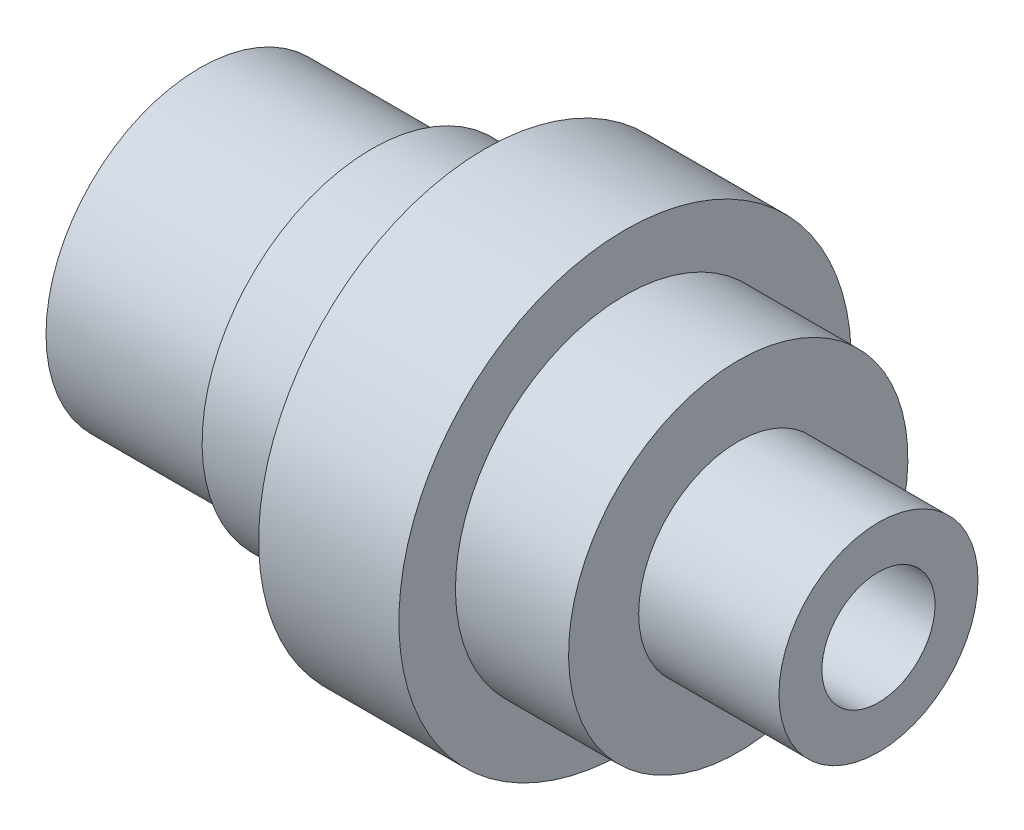
ISO-10303-21;
HEADER;
FILE_DESCRIPTION(('STEP AP214'),'2;1');
FILE_NAME('part.step','',(''),(''),'','','');
FILE_SCHEMA(('AUTOMOTIVE_DESIGN { 1 0 10303 214 1 1 1 1 }'));
ENDSEC;
DATA;
#1=APPLICATION_CONTEXT('core data for automotive mechanical design processes');
#2=APPLICATION_PROTOCOL_DEFINITION('international standard','automotive_design',2000,#1);
#3=PRODUCT_CONTEXT('',#1,'mechanical');
#4=PRODUCT('Part','Part','',(#3));
#5=PRODUCT_RELATED_PRODUCT_CATEGORY('part','',(#4));
#6=PRODUCT_DEFINITION_FORMATION('','',#4);
#7=PRODUCT_DEFINITION_CONTEXT('part definition',#1,'design');
#8=PRODUCT_DEFINITION('design','',#6,#7);
#9=PRODUCT_DEFINITION_SHAPE('','',#8);
#10=(LENGTH_UNIT() NAMED_UNIT(*) SI_UNIT(.MILLI.,.METRE.));
#11=(NAMED_UNIT(*) PLANE_ANGLE_UNIT() SI_UNIT($,.RADIAN.));
#12=(NAMED_UNIT(*) SI_UNIT($,.STERADIAN.) SOLID_ANGLE_UNIT());
#13=UNCERTAINTY_MEASURE_WITH_UNIT(LENGTH_MEASURE(1.E-05),#10,'distance_accuracy_value','');
#14=(GEOMETRIC_REPRESENTATION_CONTEXT(3) GLOBAL_UNCERTAINTY_ASSIGNED_CONTEXT((#13)) GLOBAL_UNIT_ASSIGNED_CONTEXT((#10,
#11,#12)) REPRESENTATION_CONTEXT('',''));
#15=CARTESIAN_POINT('',(0.,0.,0.));
#16=DIRECTION('',(0.,0.,1.));
#17=DIRECTION('',(1.,0.,0.));
#18=AXIS2_PLACEMENT_3D('',#15,#16,#17);
#19=CARTESIAN_POINT('',(38.1,0.,0.));
#20=DIRECTION('',(1.,0.,0.));
#21=DIRECTION('',(0.,1.,0.));
#22=AXIS2_PLACEMENT_3D('',#19,#20,#21);
#23=CYLINDRICAL_SURFACE('',#22,3.175);
#24=CARTESIAN_POINT('',(0.,0.,0.));
#25=DIRECTION('',(1.,0.,0.));
#26=DIRECTION('',(0.,1.,0.));
#27=AXIS2_PLACEMENT_3D('',#24,#25,#26);
#28=CIRCLE('',#27,3.175);
#29=CARTESIAN_POINT('',(0.,3.175,0.));
#30=VERTEX_POINT('',#29);
#31=EDGE_CURVE('E79',#30,#30,#28,.T.);
#32=ORIENTED_EDGE('',*,*,#31,.F.);
#33=EDGE_LOOP('',(#32));
#34=FACE_BOUND('',#33,.T.);
#35=CARTESIAN_POINT('',(38.1,0.,0.));
#36=DIRECTION('',(1.,0.,0.));
#37=DIRECTION('',(0.,1.,0.));
#38=AXIS2_PLACEMENT_3D('',#35,#36,#37);
#39=CIRCLE('',#38,3.175);
#40=CARTESIAN_POINT('',(38.1,3.175,0.));
#41=VERTEX_POINT('',#40);
#42=EDGE_CURVE('E10',#41,#41,#39,.T.);
#43=ORIENTED_EDGE('',*,*,#42,.T.);
#44=EDGE_LOOP('',(#43));
#45=FACE_BOUND('',#44,.T.);
#46=ADVANCED_FACE('F39',(#34,#45),#23,.F.);
#47=CARTESIAN_POINT('',(38.1,0.,0.));
#48=DIRECTION('',(-1.,0.,0.));
#49=DIRECTION('',(0.,-1.,0.));
#50=AXIS2_PLACEMENT_3D('',#47,#48,#49);
#51=PLANE('',#50);
#52=ORIENTED_EDGE('',*,*,#42,.F.);
#53=EDGE_LOOP('',(#52));
#54=FACE_BOUND('',#53,.T.);
#55=CARTESIAN_POINT('',(38.1,0.,0.));
#56=DIRECTION('',(1.,0.,0.));
#57=DIRECTION('',(0.,1.,0.));
#58=AXIS2_PLACEMENT_3D('',#55,#56,#57);
#59=CIRCLE('',#58,5.58800000000001);
#60=CARTESIAN_POINT('',(38.1,5.58800000000001,0.));
#61=VERTEX_POINT('',#60);
#62=EDGE_CURVE('E45',#61,#61,#59,.T.);
#63=ORIENTED_EDGE('',*,*,#62,.T.);
#64=EDGE_LOOP('',(#63));
#65=FACE_BOUND('',#64,.T.);
#66=ADVANCED_FACE('F86',(#54,#65),#51,.F.);
#67=CARTESIAN_POINT('',(38.1,0.,0.));
#68=DIRECTION('',(1.,0.,0.));
#69=DIRECTION('',(0.,1.,0.));
#70=AXIS2_PLACEMENT_3D('',#67,#68,#69);
#71=CYLINDRICAL_SURFACE('',#70,5.58800000000001);
#72=ORIENTED_EDGE('',*,*,#62,.F.);
#73=EDGE_LOOP('',(#72));
#74=FACE_BOUND('',#73,.T.);
#75=CARTESIAN_POINT('',(30.226,0.,0.));
#76=DIRECTION('',(1.,0.,0.));
#77=DIRECTION('',(0.,1.,0.));
#78=AXIS2_PLACEMENT_3D('',#75,#76,#77);
#79=CIRCLE('',#78,5.58800000000001);
#80=CARTESIAN_POINT('',(30.226,5.58800000000001,0.));
#81=VERTEX_POINT('',#80);
#82=EDGE_CURVE('E49',#81,#81,#79,.T.);
#83=ORIENTED_EDGE('',*,*,#82,.T.);
#84=EDGE_LOOP('',(#83));
#85=FACE_BOUND('',#84,.T.);
#86=ADVANCED_FACE('F90',(#74,#85),#71,.T.);
#87=CARTESIAN_POINT('',(30.226,0.,0.));
#88=DIRECTION('',(-1.,0.,0.));
#89=DIRECTION('',(0.,-1.,0.));
#90=AXIS2_PLACEMENT_3D('',#87,#88,#89);
#91=PLANE('',#90);
#92=ORIENTED_EDGE('',*,*,#82,.F.);
#93=EDGE_LOOP('',(#92));
#94=FACE_BOUND('',#93,.T.);
#95=CARTESIAN_POINT('',(30.226,0.,0.));
#96=DIRECTION('',(1.,0.,0.));
#97=DIRECTION('',(0.,1.,0.));
#98=AXIS2_PLACEMENT_3D('',#95,#96,#97);
#99=CIRCLE('',#98,9.525);
#100=CARTESIAN_POINT('',(30.226,9.525,0.));
#101=VERTEX_POINT('',#100);
#102=EDGE_CURVE('E53',#101,#101,#99,.T.);
#103=ORIENTED_EDGE('',*,*,#102,.T.);
#104=EDGE_LOOP('',(#103));
#105=FACE_BOUND('',#104,.T.);
#106=ADVANCED_FACE('F95',(#94,#105),#91,.F.);
#107=CARTESIAN_POINT('',(38.1,0.,0.));
#108=DIRECTION('',(1.,0.,0.));
#109=DIRECTION('',(0.,1.,0.));
#110=AXIS2_PLACEMENT_3D('',#107,#108,#109);
#111=CYLINDRICAL_SURFACE('',#110,9.525);
#112=ORIENTED_EDGE('',*,*,#102,.F.);
#113=EDGE_LOOP('',(#112));
#114=FACE_BOUND('',#113,.T.);
#115=CARTESIAN_POINT('',(23.876,0.,0.));
#116=DIRECTION('',(1.,0.,0.));
#117=DIRECTION('',(0.,1.,0.));
#118=AXIS2_PLACEMENT_3D('',#115,#116,#117);
#119=CIRCLE('',#118,9.525);
#120=CARTESIAN_POINT('',(23.876,9.525,0.));
#121=VERTEX_POINT('',#120);
#122=EDGE_CURVE('E58',#121,#121,#119,.T.);
#123=ORIENTED_EDGE('',*,*,#122,.T.);
#124=EDGE_LOOP('',(#123));
#125=FACE_BOUND('',#124,.T.);
#126=ADVANCED_FACE('F101',(#114,#125),#111,.T.);
#127=CARTESIAN_POINT('',(23.876,0.,0.));
#128=DIRECTION('',(-1.,0.,0.));
#129=DIRECTION('',(0.,-1.,0.));
#130=AXIS2_PLACEMENT_3D('',#127,#128,#129);
#131=PLANE('',#130);
#132=ORIENTED_EDGE('',*,*,#122,.F.);
#133=EDGE_LOOP('',(#132));
#134=FACE_BOUND('',#133,.T.);
#135=CARTESIAN_POINT('',(23.876,0.,0.));
#136=DIRECTION('',(1.,0.,0.));
#137=DIRECTION('',(0.,1.,0.));
#138=AXIS2_PLACEMENT_3D('',#135,#136,#137);
#139=CIRCLE('',#138,12.7);
#140=CARTESIAN_POINT('',(23.876,12.7,0.));
#141=VERTEX_POINT('',#140);
#142=EDGE_CURVE('E61',#141,#141,#139,.T.);
#143=ORIENTED_EDGE('',*,*,#142,.T.);
#144=EDGE_LOOP('',(#143));
#145=FACE_BOUND('',#144,.T.);
#146=ADVANCED_FACE('F105',(#134,#145),#131,.F.);
#147=CARTESIAN_POINT('',(38.1,0.,0.));
#148=DIRECTION('',(1.,0.,0.));
#149=DIRECTION('',(0.,1.,0.));
#150=AXIS2_PLACEMENT_3D('',#147,#148,#149);
#151=CYLINDRICAL_SURFACE('',#150,12.7);
#152=ORIENTED_EDGE('',*,*,#142,.F.);
#153=EDGE_LOOP('',(#152));
#154=FACE_BOUND('',#153,.T.);
#155=CARTESIAN_POINT('',(16.002,0.,0.));
#156=DIRECTION('',(1.,0.,0.));
#157=DIRECTION('',(0.,1.,0.));
#158=AXIS2_PLACEMENT_3D('',#155,#156,#157);
#159=CIRCLE('',#158,12.7);
#160=CARTESIAN_POINT('',(16.002,12.7,0.));
#161=VERTEX_POINT('',#160);
#162=EDGE_CURVE('E64',#161,#161,#159,.T.);
#163=ORIENTED_EDGE('',*,*,#162,.T.);
#164=EDGE_LOOP('',(#163));
#165=FACE_BOUND('',#164,.T.);
#166=ADVANCED_FACE('F109',(#154,#165),#151,.T.);
#167=CARTESIAN_POINT('',(16.002,0.,0.));
#168=DIRECTION('',(1.,0.,0.));
#169=DIRECTION('',(0.,1.,0.));
#170=AXIS2_PLACEMENT_3D('',#167,#168,#169);
#171=PLANE('',#170);
#172=ORIENTED_EDGE('',*,*,#162,.F.);
#173=EDGE_LOOP('',(#172));
#174=FACE_BOUND('',#173,.T.);
#175=CARTESIAN_POINT('',(16.002,0.,0.));
#176=DIRECTION('',(1.,0.,0.));
#177=DIRECTION('',(0.,1.,0.));
#178=AXIS2_PLACEMENT_3D('',#175,#176,#177);
#179=CIRCLE('',#178,9.525);
#180=CARTESIAN_POINT('',(16.002,9.525,0.));
#181=VERTEX_POINT('',#180);
#182=EDGE_CURVE('E67',#181,#181,#179,.T.);
#183=ORIENTED_EDGE('',*,*,#182,.T.);
#184=EDGE_LOOP('',(#183));
#185=FACE_BOUND('',#184,.T.);
#186=ADVANCED_FACE('F113',(#174,#185),#171,.F.);
#187=CARTESIAN_POINT('',(38.1,0.,0.));
#188=DIRECTION('',(1.,0.,0.));
#189=DIRECTION('',(0.,1.,0.));
#190=AXIS2_PLACEMENT_3D('',#187,#188,#189);
#191=CYLINDRICAL_SURFACE('',#190,9.525);
#192=ORIENTED_EDGE('',*,*,#182,.F.);
#193=EDGE_LOOP('',(#192));
#194=FACE_BOUND('',#193,.T.);
#195=CARTESIAN_POINT('',(9.65199999999999,0.,0.));
#196=DIRECTION('',(1.,0.,0.));
#197=DIRECTION('',(0.,1.,0.));
#198=AXIS2_PLACEMENT_3D('',#195,#196,#197);
#199=CIRCLE('',#198,9.525);
#200=CARTESIAN_POINT('',(9.65199999999999,9.525,0.));
#201=VERTEX_POINT('',#200);
#202=EDGE_CURVE('E70',#201,#201,#199,.T.);
#203=ORIENTED_EDGE('',*,*,#202,.T.);
#204=EDGE_LOOP('',(#203));
#205=FACE_BOUND('',#204,.T.);
#206=ADVANCED_FACE('F117',(#194,#205),#191,.T.);
#207=CARTESIAN_POINT('',(9.65199999999999,0.,0.));
#208=DIRECTION('',(1.,0.,0.));
#209=DIRECTION('',(0.,1.,0.));
#210=AXIS2_PLACEMENT_3D('',#207,#208,#209);
#211=PLANE('',#210);
#212=ORIENTED_EDGE('',*,*,#202,.F.);
#213=EDGE_LOOP('',(#212));
#214=FACE_BOUND('',#213,.T.);
#215=CARTESIAN_POINT('',(9.65199999999999,0.,0.));
#216=DIRECTION('',(1.,0.,0.));
#217=DIRECTION('',(0.,1.,0.));
#218=AXIS2_PLACEMENT_3D('',#215,#216,#217);
#219=CIRCLE('',#218,8.636);
#220=CARTESIAN_POINT('',(9.65199999999999,8.636,0.));
#221=VERTEX_POINT('',#220);
#222=EDGE_CURVE('E73',#221,#221,#219,.T.);
#223=ORIENTED_EDGE('',*,*,#222,.T.);
#224=EDGE_LOOP('',(#223));
#225=FACE_BOUND('',#224,.T.);
#226=ADVANCED_FACE('F121',(#214,#225),#211,.F.);
#227=CARTESIAN_POINT('',(38.1,0.,0.));
#228=DIRECTION('',(1.,0.,0.));
#229=DIRECTION('',(0.,1.,0.));
#230=AXIS2_PLACEMENT_3D('',#227,#228,#229);
#231=CYLINDRICAL_SURFACE('',#230,8.636);
#232=ORIENTED_EDGE('',*,*,#222,.F.);
#233=EDGE_LOOP('',(#232));
#234=FACE_BOUND('',#233,.T.);
#235=CARTESIAN_POINT('',(0.,0.,0.));
#236=DIRECTION('',(1.,0.,0.));
#237=DIRECTION('',(0.,1.,0.));
#238=AXIS2_PLACEMENT_3D('',#235,#236,#237);
#239=CIRCLE('',#238,8.636);
#240=CARTESIAN_POINT('',(0.,8.636,0.));
#241=VERTEX_POINT('',#240);
#242=EDGE_CURVE('E76',#241,#241,#239,.T.);
#243=ORIENTED_EDGE('',*,*,#242,.T.);
#244=EDGE_LOOP('',(#243));
#245=FACE_BOUND('',#244,.T.);
#246=ADVANCED_FACE('F125',(#234,#245),#231,.T.);
#247=CARTESIAN_POINT('',(0.,0.,0.));
#248=DIRECTION('',(1.,0.,0.));
#249=DIRECTION('',(0.,1.,0.));
#250=AXIS2_PLACEMENT_3D('',#247,#248,#249);
#251=PLANE('',#250);
#252=ORIENTED_EDGE('',*,*,#242,.F.);
#253=EDGE_LOOP('',(#252));
#254=FACE_BOUND('',#253,.T.);
#255=ORIENTED_EDGE('',*,*,#31,.T.);
#256=EDGE_LOOP('',(#255));
#257=FACE_BOUND('',#256,.T.);
#258=ADVANCED_FACE('F83',(#254,#257),#251,.F.);
#259=CLOSED_SHELL('',(#46,#66,#86,#106,#126,#146,#166,#186,#206,#226,#246,#258));
#260=MANIFOLD_SOLID_BREP('B2',#259);
#261=ADVANCED_BREP_SHAPE_REPRESENTATION('',(#18,#260),#14);
#262=SHAPE_DEFINITION_REPRESENTATION(#9,#261);
ENDSEC;
END-ISO-10303-21;
